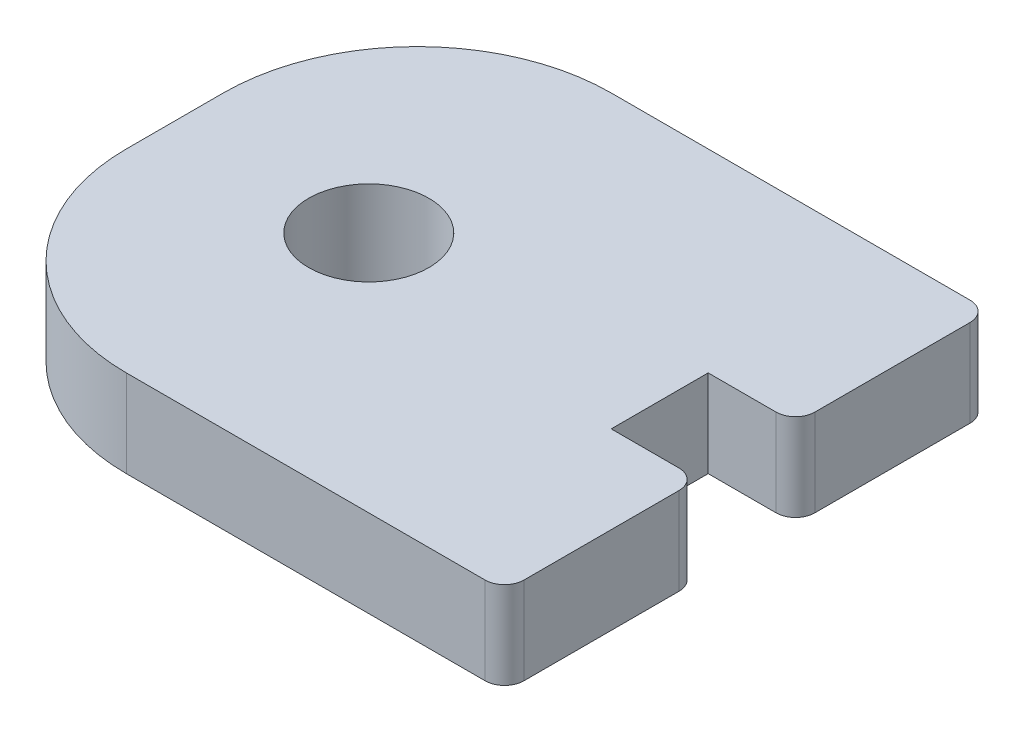
ISO-10303-21;
HEADER;
FILE_DESCRIPTION(('STEP AP214'),'2;1');
FILE_NAME('part.step','',(''),(''),'','','');
FILE_SCHEMA(('AUTOMOTIVE_DESIGN { 1 0 10303 214 1 1 1 1 }'));
ENDSEC;
DATA;
#1=APPLICATION_CONTEXT('core data for automotive mechanical design processes');
#2=APPLICATION_PROTOCOL_DEFINITION('international standard','automotive_design',2000,#1);
#3=PRODUCT_CONTEXT('',#1,'mechanical');
#4=PRODUCT('Part','Part','',(#3));
#5=PRODUCT_RELATED_PRODUCT_CATEGORY('part','',(#4));
#6=PRODUCT_DEFINITION_FORMATION('','',#4);
#7=PRODUCT_DEFINITION_CONTEXT('part definition',#1,'design');
#8=PRODUCT_DEFINITION('design','',#6,#7);
#9=PRODUCT_DEFINITION_SHAPE('','',#8);
#10=(LENGTH_UNIT() NAMED_UNIT(*) SI_UNIT(.MILLI.,.METRE.));
#11=(NAMED_UNIT(*) PLANE_ANGLE_UNIT() SI_UNIT($,.RADIAN.));
#12=(NAMED_UNIT(*) SI_UNIT($,.STERADIAN.) SOLID_ANGLE_UNIT());
#13=UNCERTAINTY_MEASURE_WITH_UNIT(LENGTH_MEASURE(1.E-05),#10,'distance_accuracy_value','');
#14=(GEOMETRIC_REPRESENTATION_CONTEXT(3) GLOBAL_UNCERTAINTY_ASSIGNED_CONTEXT((#13)) GLOBAL_UNIT_ASSIGNED_CONTEXT((#10,
#11,#12)) REPRESENTATION_CONTEXT('',''));
#15=CARTESIAN_POINT('',(0.,0.,0.));
#16=DIRECTION('',(0.,0.,1.));
#17=DIRECTION('',(1.,0.,0.));
#18=AXIS2_PLACEMENT_3D('',#15,#16,#17);
#19=CARTESIAN_POINT('',(28.5,4.5,-24.));
#20=DIRECTION('',(0.,-1.,0.));
#21=DIRECTION('',(0.,0.,-1.));
#22=AXIS2_PLACEMENT_3D('',#19,#20,#21);
#23=PLANE('',#22);
#24=DIRECTION('',(-1.,0.,0.));
#25=VECTOR('',#24,1.);
#26=CARTESIAN_POINT('',(25.,4.5,-25.));
#27=LINE('',#26,#25);
#28=CARTESIAN_POINT('',(28.5,4.5,-25.));
#29=VERTEX_POINT('',#28);
#30=CARTESIAN_POINT('',(10.0000000000001,4.5,-25.));
#31=VERTEX_POINT('',#30);
#32=EDGE_CURVE('E110',#29,#31,#27,.T.);
#33=ORIENTED_EDGE('',*,*,#32,.T.);
#34=CARTESIAN_POINT('',(10.,4.5,-15.));
#35=DIRECTION('',(0.,1.,0.));
#36=DIRECTION('',(0.,0.,-1.));
#37=AXIS2_PLACEMENT_3D('',#34,#35,#36);
#38=CIRCLE('',#37,10.);
#39=CARTESIAN_POINT('',(0.,4.5,-14.9999999999999));
#40=VERTEX_POINT('',#39);
#41=EDGE_CURVE('E271',#31,#40,#38,.T.);
#42=ORIENTED_EDGE('',*,*,#41,.T.);
#43=DIRECTION('',(0.,0.,1.));
#44=VECTOR('',#43,1.);
#45=CARTESIAN_POINT('',(0.,4.5,-10.0000000000001));
#46=LINE('',#45,#44);
#47=CARTESIAN_POINT('',(0.,4.5,-10.0000000000001));
#48=VERTEX_POINT('',#47);
#49=EDGE_CURVE('E227',#40,#48,#46,.T.);
#50=ORIENTED_EDGE('',*,*,#49,.T.);
#51=CARTESIAN_POINT('',(10.,4.5,-10.));
#52=DIRECTION('',(0.,1.,0.));
#53=DIRECTION('',(0.,0.,-1.));
#54=AXIS2_PLACEMENT_3D('',#51,#52,#53);
#55=CIRCLE('',#54,10.);
#56=CARTESIAN_POINT('',(10.0000000000001,4.5,0.));
#57=VERTEX_POINT('',#56);
#58=EDGE_CURVE('E245',#48,#57,#55,.T.);
#59=ORIENTED_EDGE('',*,*,#58,.T.);
#60=DIRECTION('',(1.,0.,0.));
#61=VECTOR('',#60,1.);
#62=CARTESIAN_POINT('',(10.0000000000001,4.5,0.));
#63=LINE('',#62,#61);
#64=CARTESIAN_POINT('',(28.5,4.5,0.));
#65=VERTEX_POINT('',#64);
#66=EDGE_CURVE('E242',#57,#65,#63,.T.);
#67=ORIENTED_EDGE('',*,*,#66,.T.);
#68=CARTESIAN_POINT('',(28.5,4.5,-1.));
#69=DIRECTION('',(0.,1.,0.));
#70=DIRECTION('',(0.,0.,1.));
#71=AXIS2_PLACEMENT_3D('',#68,#69,#70);
#72=CIRCLE('',#71,1.);
#73=CARTESIAN_POINT('',(29.5,4.5,-1.00000000000001));
#74=VERTEX_POINT('',#73);
#75=EDGE_CURVE('E244',#65,#74,#72,.T.);
#76=ORIENTED_EDGE('',*,*,#75,.T.);
#77=DIRECTION('',(0.,0.,-1.));
#78=VECTOR('',#77,1.);
#79=CARTESIAN_POINT('',(29.5,4.5,-1.00000000000001));
#80=LINE('',#79,#78);
#81=CARTESIAN_POINT('',(29.5,4.5,-8.99999999999999));
#82=VERTEX_POINT('',#81);
#83=EDGE_CURVE('E247',#74,#82,#80,.T.);
#84=ORIENTED_EDGE('',*,*,#83,.T.);
#85=CARTESIAN_POINT('',(28.5,4.5,-9.));
#86=DIRECTION('',(0.,1.,0.));
#87=DIRECTION('',(0.,0.,-1.));
#88=AXIS2_PLACEMENT_3D('',#85,#86,#87);
#89=CIRCLE('',#88,1.);
#90=CARTESIAN_POINT('',(28.5,4.5,-10.));
#91=VERTEX_POINT('',#90);
#92=EDGE_CURVE('E253',#82,#91,#89,.T.);
#93=ORIENTED_EDGE('',*,*,#92,.T.);
#94=DIRECTION('',(-1.,0.,0.));
#95=VECTOR('',#94,1.);
#96=CARTESIAN_POINT('',(25.,4.5,-10.));
#97=LINE('',#96,#95);
#98=CARTESIAN_POINT('',(25.,4.5,-10.));
#99=VERTEX_POINT('',#98);
#100=EDGE_CURVE('E255',#91,#99,#97,.T.);
#101=ORIENTED_EDGE('',*,*,#100,.T.);
#102=DIRECTION('',(0.,0.,-1.));
#103=VECTOR('',#102,1.);
#104=CARTESIAN_POINT('',(25.,4.5,-10.));
#105=LINE('',#104,#103);
#106=CARTESIAN_POINT('',(25.,4.5,-15.));
#107=VERTEX_POINT('',#106);
#108=EDGE_CURVE('E257',#99,#107,#105,.T.);
#109=ORIENTED_EDGE('',*,*,#108,.T.);
#110=DIRECTION('',(1.,0.,0.));
#111=VECTOR('',#110,1.);
#112=CARTESIAN_POINT('',(25.,4.5,-15.));
#113=LINE('',#112,#111);
#114=CARTESIAN_POINT('',(28.5,4.5,-15.));
#115=VERTEX_POINT('',#114);
#116=EDGE_CURVE('E148',#107,#115,#113,.T.);
#117=ORIENTED_EDGE('',*,*,#116,.T.);
#118=CARTESIAN_POINT('',(28.5,4.5,-16.));
#119=DIRECTION('',(0.,1.,0.));
#120=DIRECTION('',(0.,0.,1.));
#121=AXIS2_PLACEMENT_3D('',#118,#119,#120);
#122=CIRCLE('',#121,1.);
#123=CARTESIAN_POINT('',(29.5,4.5,-16.));
#124=VERTEX_POINT('',#123);
#125=EDGE_CURVE('E142',#115,#124,#122,.T.);
#126=ORIENTED_EDGE('',*,*,#125,.T.);
#127=DIRECTION('',(0.,0.,-1.));
#128=VECTOR('',#127,1.);
#129=CARTESIAN_POINT('',(29.5,4.5,-24.));
#130=LINE('',#129,#128);
#131=CARTESIAN_POINT('',(29.5,4.5,-24.));
#132=VERTEX_POINT('',#131);
#133=EDGE_CURVE('E146',#124,#132,#130,.T.);
#134=ORIENTED_EDGE('',*,*,#133,.T.);
#135=CARTESIAN_POINT('',(28.5,4.5,-24.));
#136=DIRECTION('',(0.,1.,0.));
#137=DIRECTION('',(0.,0.,-1.));
#138=AXIS2_PLACEMENT_3D('',#135,#136,#137);
#139=CIRCLE('',#138,1.);
#140=EDGE_CURVE('E50',#132,#29,#139,.T.);
#141=ORIENTED_EDGE('',*,*,#140,.T.);
#142=EDGE_LOOP('',(#33,#42,#50,#59,#67,#76,#84,#93,#101,#109,#117,#126,#134,#141));
#143=FACE_BOUND('',#142,.T.);
#144=CARTESIAN_POINT('',(10.,4.5,-12.5));
#145=DIRECTION('',(0.,1.,0.));
#146=DIRECTION('',(0.,0.,1.));
#147=AXIS2_PLACEMENT_3D('',#144,#145,#146);
#148=CIRCLE('',#147,3.1);
#149=CARTESIAN_POINT('',(10.,4.5,-9.4));
#150=VERTEX_POINT('',#149);
#151=EDGE_CURVE('E168',#150,#150,#148,.T.);
#152=ORIENTED_EDGE('',*,*,#151,.F.);
#153=EDGE_LOOP('',(#152));
#154=FACE_BOUND('',#153,.T.);
#155=ADVANCED_FACE('F33',(#143,#154),#23,.F.);
#156=CARTESIAN_POINT('',(28.5,0.,-24.));
#157=DIRECTION('',(0.,-1.,0.));
#158=DIRECTION('',(0.,0.,-1.));
#159=AXIS2_PLACEMENT_3D('',#156,#157,#158);
#160=PLANE('',#159);
#161=DIRECTION('',(-1.,0.,0.));
#162=VECTOR('',#161,1.);
#163=CARTESIAN_POINT('',(10.0000000000001,0.,-25.));
#164=LINE('',#163,#162);
#165=CARTESIAN_POINT('',(28.5,0.,-25.));
#166=VERTEX_POINT('',#165);
#167=CARTESIAN_POINT('',(10.0000000000001,0.,-25.));
#168=VERTEX_POINT('',#167);
#169=EDGE_CURVE('E104',#166,#168,#164,.T.);
#170=ORIENTED_EDGE('',*,*,#169,.F.);
#171=CARTESIAN_POINT('',(28.5,0.,-24.));
#172=DIRECTION('',(0.,1.,0.));
#173=DIRECTION('',(0.,0.,-1.));
#174=AXIS2_PLACEMENT_3D('',#171,#172,#173);
#175=CIRCLE('',#174,1.);
#176=CARTESIAN_POINT('',(29.5,0.,-24.));
#177=VERTEX_POINT('',#176);
#178=EDGE_CURVE('E191',#177,#166,#175,.T.);
#179=ORIENTED_EDGE('',*,*,#178,.F.);
#180=DIRECTION('',(0.,0.,-1.));
#181=VECTOR('',#180,1.);
#182=CARTESIAN_POINT('',(29.5,0.,-24.));
#183=LINE('',#182,#181);
#184=CARTESIAN_POINT('',(29.5,0.,-16.));
#185=VERTEX_POINT('',#184);
#186=EDGE_CURVE('E97',#185,#177,#183,.T.);
#187=ORIENTED_EDGE('',*,*,#186,.F.);
#188=CARTESIAN_POINT('',(28.5,0.,-16.));
#189=DIRECTION('',(0.,1.,0.));
#190=DIRECTION('',(0.,0.,1.));
#191=AXIS2_PLACEMENT_3D('',#188,#189,#190);
#192=CIRCLE('',#191,1.);
#193=CARTESIAN_POINT('',(28.5,0.,-15.));
#194=VERTEX_POINT('',#193);
#195=EDGE_CURVE('E156',#194,#185,#192,.T.);
#196=ORIENTED_EDGE('',*,*,#195,.F.);
#197=DIRECTION('',(1.,0.,0.));
#198=VECTOR('',#197,1.);
#199=CARTESIAN_POINT('',(25.,0.,-15.));
#200=LINE('',#199,#198);
#201=CARTESIAN_POINT('',(25.,0.,-15.));
#202=VERTEX_POINT('',#201);
#203=EDGE_CURVE('E187',#202,#194,#200,.T.);
#204=ORIENTED_EDGE('',*,*,#203,.F.);
#205=DIRECTION('',(0.,0.,-1.));
#206=VECTOR('',#205,1.);
#207=CARTESIAN_POINT('',(25.,0.,-10.));
#208=LINE('',#207,#206);
#209=CARTESIAN_POINT('',(25.,0.,-10.));
#210=VERTEX_POINT('',#209);
#211=EDGE_CURVE('E185',#210,#202,#208,.T.);
#212=ORIENTED_EDGE('',*,*,#211,.F.);
#213=DIRECTION('',(-1.,0.,0.));
#214=VECTOR('',#213,1.);
#215=CARTESIAN_POINT('',(25.,0.,-10.));
#216=LINE('',#215,#214);
#217=CARTESIAN_POINT('',(28.5,0.,-10.));
#218=VERTEX_POINT('',#217);
#219=EDGE_CURVE('E183',#218,#210,#216,.T.);
#220=ORIENTED_EDGE('',*,*,#219,.F.);
#221=CARTESIAN_POINT('',(28.5,0.,-9.));
#222=DIRECTION('',(0.,1.,0.));
#223=DIRECTION('',(0.,0.,-1.));
#224=AXIS2_PLACEMENT_3D('',#221,#222,#223);
#225=CIRCLE('',#224,1.);
#226=CARTESIAN_POINT('',(29.5,0.,-8.99999999999999));
#227=VERTEX_POINT('',#226);
#228=EDGE_CURVE('E181',#227,#218,#225,.T.);
#229=ORIENTED_EDGE('',*,*,#228,.F.);
#230=DIRECTION('',(0.,0.,-1.));
#231=VECTOR('',#230,1.);
#232=CARTESIAN_POINT('',(29.5,0.,-1.00000000000001));
#233=LINE('',#232,#231);
#234=CARTESIAN_POINT('',(29.5,0.,-1.00000000000001));
#235=VERTEX_POINT('',#234);
#236=EDGE_CURVE('E179',#235,#227,#233,.T.);
#237=ORIENTED_EDGE('',*,*,#236,.F.);
#238=CARTESIAN_POINT('',(28.5,0.,-1.));
#239=DIRECTION('',(0.,1.,0.));
#240=DIRECTION('',(0.,0.,1.));
#241=AXIS2_PLACEMENT_3D('',#238,#239,#240);
#242=CIRCLE('',#241,1.);
#243=CARTESIAN_POINT('',(28.5,0.,0.));
#244=VERTEX_POINT('',#243);
#245=EDGE_CURVE('E177',#244,#235,#242,.T.);
#246=ORIENTED_EDGE('',*,*,#245,.F.);
#247=DIRECTION('',(1.,0.,0.));
#248=VECTOR('',#247,1.);
#249=CARTESIAN_POINT('',(25.,0.,0.));
#250=LINE('',#249,#248);
#251=CARTESIAN_POINT('',(10.0000000000001,0.,0.));
#252=VERTEX_POINT('',#251);
#253=EDGE_CURVE('E175',#252,#244,#250,.T.);
#254=ORIENTED_EDGE('',*,*,#253,.F.);
#255=CARTESIAN_POINT('',(10.,0.,-10.));
#256=DIRECTION('',(0.,1.,0.));
#257=DIRECTION('',(0.,0.,-1.));
#258=AXIS2_PLACEMENT_3D('',#255,#256,#257);
#259=CIRCLE('',#258,10.);
#260=CARTESIAN_POINT('',(0.,0.,-10.0000000000001));
#261=VERTEX_POINT('',#260);
#262=EDGE_CURVE('E172',#261,#252,#259,.T.);
#263=ORIENTED_EDGE('',*,*,#262,.F.);
#264=DIRECTION('',(0.,0.,1.));
#265=VECTOR('',#264,1.);
#266=CARTESIAN_POINT('',(0.,0.,-10.0000000000001));
#267=LINE('',#266,#265);
#268=CARTESIAN_POINT('',(0.,0.,-14.9999999999999));
#269=VERTEX_POINT('',#268);
#270=EDGE_CURVE('E170',#269,#261,#267,.T.);
#271=ORIENTED_EDGE('',*,*,#270,.F.);
#272=CARTESIAN_POINT('',(10.,0.,-15.));
#273=DIRECTION('',(0.,1.,0.));
#274=DIRECTION('',(0.,0.,-1.));
#275=AXIS2_PLACEMENT_3D('',#272,#273,#274);
#276=CIRCLE('',#275,10.);
#277=EDGE_CURVE('E167',#168,#269,#276,.T.);
#278=ORIENTED_EDGE('',*,*,#277,.F.);
#279=EDGE_LOOP('',(#170,#179,#187,#196,#204,#212,#220,#229,#237,#246,#254,#263,#271,#278));
#280=FACE_BOUND('',#279,.T.);
#281=CARTESIAN_POINT('',(10.,0.,-12.5));
#282=DIRECTION('',(0.,1.,0.));
#283=DIRECTION('',(0.,0.,1.));
#284=AXIS2_PLACEMENT_3D('',#281,#282,#283);
#285=CIRCLE('',#284,3.1);
#286=CARTESIAN_POINT('',(10.,0.,-9.4));
#287=VERTEX_POINT('',#286);
#288=EDGE_CURVE('E275',#287,#287,#285,.T.);
#289=ORIENTED_EDGE('',*,*,#288,.T.);
#290=EDGE_LOOP('',(#289));
#291=FACE_BOUND('',#290,.T.);
#292=ADVANCED_FACE('F231',(#280,#291),#160,.T.);
#293=CARTESIAN_POINT('',(10.0000000000001,4.5,-25.));
#294=DIRECTION('',(0.,0.,1.));
#295=DIRECTION('',(1.,0.,0.));
#296=AXIS2_PLACEMENT_3D('',#293,#294,#295);
#297=PLANE('',#296);
#298=ORIENTED_EDGE('',*,*,#169,.T.);
#299=DIRECTION('',(0.,-1.,0.));
#300=VECTOR('',#299,1.);
#301=CARTESIAN_POINT('',(10.0000000000001,4.5,-25.));
#302=LINE('',#301,#300);
#303=EDGE_CURVE('E11',#31,#168,#302,.T.);
#304=ORIENTED_EDGE('',*,*,#303,.F.);
#305=ORIENTED_EDGE('',*,*,#32,.F.);
#306=DIRECTION('',(0.,-1.,0.));
#307=VECTOR('',#306,1.);
#308=CARTESIAN_POINT('',(28.5,4.5,-25.));
#309=LINE('',#308,#307);
#310=EDGE_CURVE('E162',#29,#166,#309,.T.);
#311=ORIENTED_EDGE('',*,*,#310,.T.);
#312=EDGE_LOOP('',(#298,#304,#305,#311));
#313=FACE_BOUND('',#312,.T.);
#314=ADVANCED_FACE('F35',(#313),#297,.F.);
#315=CARTESIAN_POINT('',(10.,4.5,-15.));
#316=DIRECTION('',(0.,-1.,0.));
#317=DIRECTION('',(0.,0.,-1.));
#318=AXIS2_PLACEMENT_3D('',#315,#316,#317);
#319=CYLINDRICAL_SURFACE('',#318,10.);
#320=ORIENTED_EDGE('',*,*,#277,.T.);
#321=DIRECTION('',(0.,-1.,0.));
#322=VECTOR('',#321,1.);
#323=CARTESIAN_POINT('',(0.,4.5,-14.9999999999999));
#324=LINE('',#323,#322);
#325=EDGE_CURVE('E42',#40,#269,#324,.T.);
#326=ORIENTED_EDGE('',*,*,#325,.F.);
#327=ORIENTED_EDGE('',*,*,#41,.F.);
#328=ORIENTED_EDGE('',*,*,#303,.T.);
#329=EDGE_LOOP('',(#320,#326,#327,#328));
#330=FACE_BOUND('',#329,.T.);
#331=ADVANCED_FACE('F277',(#330),#319,.T.);
#332=CARTESIAN_POINT('',(0.,4.5,-10.0000000000001));
#333=DIRECTION('',(1.,0.,0.));
#334=DIRECTION('',(0.,0.,-1.));
#335=AXIS2_PLACEMENT_3D('',#332,#333,#334);
#336=PLANE('',#335);
#337=ORIENTED_EDGE('',*,*,#270,.T.);
#338=DIRECTION('',(0.,-1.,0.));
#339=VECTOR('',#338,1.);
#340=CARTESIAN_POINT('',(0.,4.5,-10.0000000000001));
#341=LINE('',#340,#339);
#342=EDGE_CURVE('E218',#48,#261,#341,.T.);
#343=ORIENTED_EDGE('',*,*,#342,.F.);
#344=ORIENTED_EDGE('',*,*,#49,.F.);
#345=ORIENTED_EDGE('',*,*,#325,.T.);
#346=EDGE_LOOP('',(#337,#343,#344,#345));
#347=FACE_BOUND('',#346,.T.);
#348=ADVANCED_FACE('F225',(#347),#336,.F.);
#349=CARTESIAN_POINT('',(10.,4.5,-10.));
#350=DIRECTION('',(0.,-1.,0.));
#351=DIRECTION('',(0.,0.,-1.));
#352=AXIS2_PLACEMENT_3D('',#349,#350,#351);
#353=CYLINDRICAL_SURFACE('',#352,10.);
#354=ORIENTED_EDGE('',*,*,#262,.T.);
#355=DIRECTION('',(0.,-1.,0.));
#356=VECTOR('',#355,1.);
#357=CARTESIAN_POINT('',(10.0000000000001,4.5,0.));
#358=LINE('',#357,#356);
#359=EDGE_CURVE('E215',#57,#252,#358,.T.);
#360=ORIENTED_EDGE('',*,*,#359,.F.);
#361=ORIENTED_EDGE('',*,*,#58,.F.);
#362=ORIENTED_EDGE('',*,*,#342,.T.);
#363=EDGE_LOOP('',(#354,#360,#361,#362));
#364=FACE_BOUND('',#363,.T.);
#365=ADVANCED_FACE('F236',(#364),#353,.T.);
#366=CARTESIAN_POINT('',(25.,4.5,0.));
#367=DIRECTION('',(0.,0.,-1.));
#368=DIRECTION('',(-1.,0.,0.));
#369=AXIS2_PLACEMENT_3D('',#366,#367,#368);
#370=PLANE('',#369);
#371=ORIENTED_EDGE('',*,*,#253,.T.);
#372=DIRECTION('',(0.,-1.,0.));
#373=VECTOR('',#372,1.);
#374=CARTESIAN_POINT('',(28.5,4.5,0.));
#375=LINE('',#374,#373);
#376=EDGE_CURVE('E212',#65,#244,#375,.T.);
#377=ORIENTED_EDGE('',*,*,#376,.F.);
#378=ORIENTED_EDGE('',*,*,#66,.F.);
#379=ORIENTED_EDGE('',*,*,#359,.T.);
#380=EDGE_LOOP('',(#371,#377,#378,#379));
#381=FACE_BOUND('',#380,.T.);
#382=ADVANCED_FACE('F240',(#381),#370,.F.);
#383=CARTESIAN_POINT('',(28.5,4.5,-1.));
#384=DIRECTION('',(0.,-1.,0.));
#385=DIRECTION('',(0.,0.,-1.));
#386=AXIS2_PLACEMENT_3D('',#383,#384,#385);
#387=CYLINDRICAL_SURFACE('',#386,1.);
#388=ORIENTED_EDGE('',*,*,#245,.T.);
#389=DIRECTION('',(0.,-1.,0.));
#390=VECTOR('',#389,1.);
#391=CARTESIAN_POINT('',(29.5,4.5,-1.00000000000001));
#392=LINE('',#391,#390);
#393=EDGE_CURVE('E209',#74,#235,#392,.T.);
#394=ORIENTED_EDGE('',*,*,#393,.F.);
#395=ORIENTED_EDGE('',*,*,#75,.F.);
#396=ORIENTED_EDGE('',*,*,#376,.T.);
#397=EDGE_LOOP('',(#388,#394,#395,#396));
#398=FACE_BOUND('',#397,.T.);
#399=ADVANCED_FACE('F314',(#398),#387,.T.);
#400=CARTESIAN_POINT('',(29.5,4.5,-1.00000000000001));
#401=DIRECTION('',(-1.,0.,0.));
#402=DIRECTION('',(0.,0.,1.));
#403=AXIS2_PLACEMENT_3D('',#400,#401,#402);
#404=PLANE('',#403);
#405=ORIENTED_EDGE('',*,*,#236,.T.);
#406=DIRECTION('',(0.,-1.,0.));
#407=VECTOR('',#406,1.);
#408=CARTESIAN_POINT('',(29.5,4.5,-8.99999999999999));
#409=LINE('',#408,#407);
#410=EDGE_CURVE('E206',#82,#227,#409,.T.);
#411=ORIENTED_EDGE('',*,*,#410,.F.);
#412=ORIENTED_EDGE('',*,*,#83,.F.);
#413=ORIENTED_EDGE('',*,*,#393,.T.);
#414=EDGE_LOOP('',(#405,#411,#412,#413));
#415=FACE_BOUND('',#414,.T.);
#416=ADVANCED_FACE('F310',(#415),#404,.F.);
#417=CARTESIAN_POINT('',(28.5,4.5,-9.));
#418=DIRECTION('',(0.,-1.,0.));
#419=DIRECTION('',(0.,0.,-1.));
#420=AXIS2_PLACEMENT_3D('',#417,#418,#419);
#421=CYLINDRICAL_SURFACE('',#420,1.);
#422=ORIENTED_EDGE('',*,*,#228,.T.);
#423=DIRECTION('',(0.,-1.,0.));
#424=VECTOR('',#423,1.);
#425=CARTESIAN_POINT('',(28.5,4.5,-10.));
#426=LINE('',#425,#424);
#427=EDGE_CURVE('E203',#91,#218,#426,.T.);
#428=ORIENTED_EDGE('',*,*,#427,.F.);
#429=ORIENTED_EDGE('',*,*,#92,.F.);
#430=ORIENTED_EDGE('',*,*,#410,.T.);
#431=EDGE_LOOP('',(#422,#428,#429,#430));
#432=FACE_BOUND('',#431,.T.);
#433=ADVANCED_FACE('F306',(#432),#421,.T.);
#434=CARTESIAN_POINT('',(25.,4.5,-10.));
#435=DIRECTION('',(0.,0.,1.));
#436=DIRECTION('',(1.,0.,0.));
#437=AXIS2_PLACEMENT_3D('',#434,#435,#436);
#438=PLANE('',#437);
#439=ORIENTED_EDGE('',*,*,#219,.T.);
#440=DIRECTION('',(0.,-1.,0.));
#441=VECTOR('',#440,1.);
#442=CARTESIAN_POINT('',(25.,4.5,-10.));
#443=LINE('',#442,#441);
#444=EDGE_CURVE('E200',#99,#210,#443,.T.);
#445=ORIENTED_EDGE('',*,*,#444,.F.);
#446=ORIENTED_EDGE('',*,*,#100,.F.);
#447=ORIENTED_EDGE('',*,*,#427,.T.);
#448=EDGE_LOOP('',(#439,#445,#446,#447));
#449=FACE_BOUND('',#448,.T.);
#450=ADVANCED_FACE('F303',(#449),#438,.F.);
#451=CARTESIAN_POINT('',(25.,4.5,-10.));
#452=DIRECTION('',(-1.,0.,0.));
#453=DIRECTION('',(0.,0.,1.));
#454=AXIS2_PLACEMENT_3D('',#451,#452,#453);
#455=PLANE('',#454);
#456=ORIENTED_EDGE('',*,*,#211,.T.);
#457=DIRECTION('',(0.,-1.,0.));
#458=VECTOR('',#457,1.);
#459=CARTESIAN_POINT('',(25.,4.5,-15.));
#460=LINE('',#459,#458);
#461=EDGE_CURVE('E197',#107,#202,#460,.T.);
#462=ORIENTED_EDGE('',*,*,#461,.F.);
#463=ORIENTED_EDGE('',*,*,#108,.F.);
#464=ORIENTED_EDGE('',*,*,#444,.T.);
#465=EDGE_LOOP('',(#456,#462,#463,#464));
#466=FACE_BOUND('',#465,.T.);
#467=ADVANCED_FACE('F263',(#466),#455,.F.);
#468=CARTESIAN_POINT('',(25.,4.5,-15.));
#469=DIRECTION('',(0.,0.,-1.));
#470=DIRECTION('',(-1.,0.,0.));
#471=AXIS2_PLACEMENT_3D('',#468,#469,#470);
#472=PLANE('',#471);
#473=ORIENTED_EDGE('',*,*,#203,.T.);
#474=DIRECTION('',(0.,-1.,0.));
#475=VECTOR('',#474,1.);
#476=CARTESIAN_POINT('',(28.5,4.5,-15.));
#477=LINE('',#476,#475);
#478=EDGE_CURVE('E157',#115,#194,#477,.T.);
#479=ORIENTED_EDGE('',*,*,#478,.F.);
#480=ORIENTED_EDGE('',*,*,#116,.F.);
#481=ORIENTED_EDGE('',*,*,#461,.T.);
#482=EDGE_LOOP('',(#473,#479,#480,#481));
#483=FACE_BOUND('',#482,.T.);
#484=ADVANCED_FACE('F267',(#483),#472,.F.);
#485=CARTESIAN_POINT('',(28.5,4.5,-16.));
#486=DIRECTION('',(0.,-1.,0.));
#487=DIRECTION('',(0.,0.,-1.));
#488=AXIS2_PLACEMENT_3D('',#485,#486,#487);
#489=CYLINDRICAL_SURFACE('',#488,1.);
#490=ORIENTED_EDGE('',*,*,#195,.T.);
#491=DIRECTION('',(0.,-1.,0.));
#492=VECTOR('',#491,1.);
#493=CARTESIAN_POINT('',(29.5,4.5,-16.));
#494=LINE('',#493,#492);
#495=EDGE_CURVE('E153',#124,#185,#494,.T.);
#496=ORIENTED_EDGE('',*,*,#495,.F.);
#497=ORIENTED_EDGE('',*,*,#125,.F.);
#498=ORIENTED_EDGE('',*,*,#478,.T.);
#499=EDGE_LOOP('',(#490,#496,#497,#498));
#500=FACE_BOUND('',#499,.T.);
#501=ADVANCED_FACE('F154',(#500),#489,.T.);
#502=CARTESIAN_POINT('',(29.5,4.5,-24.));
#503=DIRECTION('',(-1.,0.,0.));
#504=DIRECTION('',(0.,0.,1.));
#505=AXIS2_PLACEMENT_3D('',#502,#503,#504);
#506=PLANE('',#505);
#507=ORIENTED_EDGE('',*,*,#186,.T.);
#508=DIRECTION('',(0.,-1.,0.));
#509=VECTOR('',#508,1.);
#510=CARTESIAN_POINT('',(29.5,4.5,-24.));
#511=LINE('',#510,#509);
#512=EDGE_CURVE('E158',#132,#177,#511,.T.);
#513=ORIENTED_EDGE('',*,*,#512,.F.);
#514=ORIENTED_EDGE('',*,*,#133,.F.);
#515=ORIENTED_EDGE('',*,*,#495,.T.);
#516=EDGE_LOOP('',(#507,#513,#514,#515));
#517=FACE_BOUND('',#516,.T.);
#518=ADVANCED_FACE('F160',(#517),#506,.F.);
#519=CARTESIAN_POINT('',(28.5,4.5,-24.));
#520=DIRECTION('',(0.,-1.,0.));
#521=DIRECTION('',(0.,0.,-1.));
#522=AXIS2_PLACEMENT_3D('',#519,#520,#521);
#523=CYLINDRICAL_SURFACE('',#522,1.);
#524=ORIENTED_EDGE('',*,*,#178,.T.);
#525=ORIENTED_EDGE('',*,*,#310,.F.);
#526=ORIENTED_EDGE('',*,*,#140,.F.);
#527=ORIENTED_EDGE('',*,*,#512,.T.);
#528=EDGE_LOOP('',(#524,#525,#526,#527));
#529=FACE_BOUND('',#528,.T.);
#530=ADVANCED_FACE('F269',(#529),#523,.T.);
#531=CARTESIAN_POINT('',(10.,4.5,-12.5));
#532=DIRECTION('',(0.,-1.,0.));
#533=DIRECTION('',(0.,0.,-1.));
#534=AXIS2_PLACEMENT_3D('',#531,#532,#533);
#535=CYLINDRICAL_SURFACE('',#534,3.1);
#536=ORIENTED_EDGE('',*,*,#151,.T.);
#537=EDGE_LOOP('',(#536));
#538=FACE_BOUND('',#537,.T.);
#539=ORIENTED_EDGE('',*,*,#288,.F.);
#540=EDGE_LOOP('',(#539));
#541=FACE_BOUND('',#540,.T.);
#542=ADVANCED_FACE('F291',(#538,#541),#535,.F.);
#543=CLOSED_SHELL('',(#155,#292,#314,#331,#348,#365,#382,#399,#416,#433,#450,#467,#484,#501,
#518,#530,#542));
#544=MANIFOLD_SOLID_BREP('B2',#543);
#545=ADVANCED_BREP_SHAPE_REPRESENTATION('',(#18,#544),#14);
#546=SHAPE_DEFINITION_REPRESENTATION(#9,#545);
ENDSEC;
END-ISO-10303-21;
